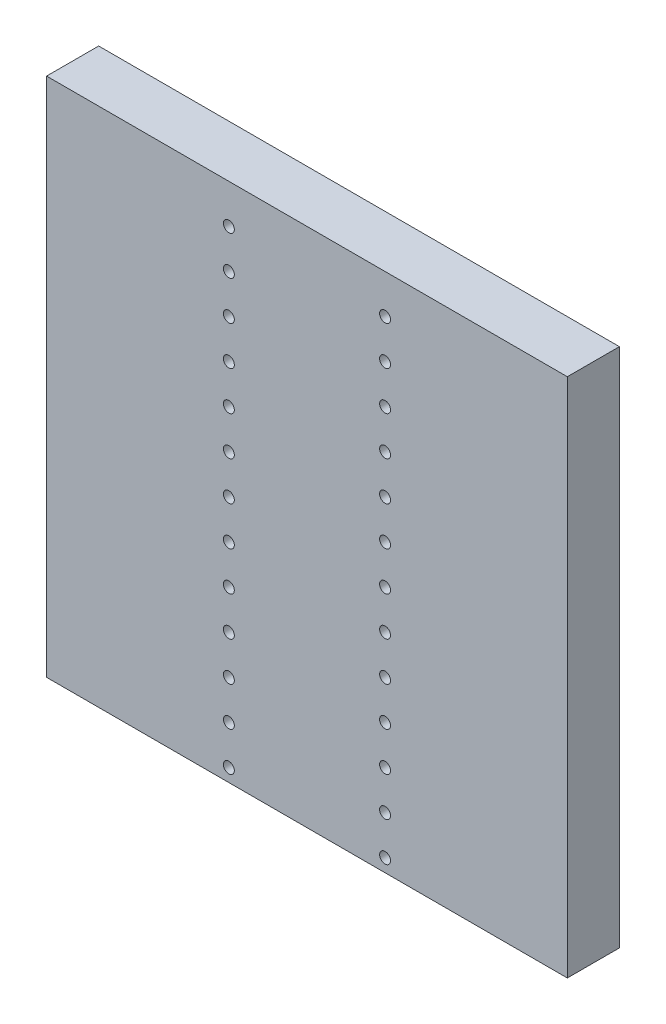
ISO-10303-21;
HEADER;
FILE_DESCRIPTION(('STEP AP214'),'2;1');
FILE_NAME('part.step','',(''),(''),'','','');
FILE_SCHEMA(('AUTOMOTIVE_DESIGN { 1 0 10303 214 1 1 1 1 }'));
ENDSEC;
DATA;
#1=APPLICATION_CONTEXT('core data for automotive mechanical design processes');
#2=APPLICATION_PROTOCOL_DEFINITION('international standard','automotive_design',2000,#1);
#3=PRODUCT_CONTEXT('',#1,'mechanical');
#4=PRODUCT('Part','Part','',(#3));
#5=PRODUCT_RELATED_PRODUCT_CATEGORY('part','',(#4));
#6=PRODUCT_DEFINITION_FORMATION('','',#4);
#7=PRODUCT_DEFINITION_CONTEXT('part definition',#1,'design');
#8=PRODUCT_DEFINITION('design','',#6,#7);
#9=PRODUCT_DEFINITION_SHAPE('','',#8);
#10=(LENGTH_UNIT() NAMED_UNIT(*) SI_UNIT(.MILLI.,.METRE.));
#11=(NAMED_UNIT(*) PLANE_ANGLE_UNIT() SI_UNIT($,.RADIAN.));
#12=(NAMED_UNIT(*) SI_UNIT($,.STERADIAN.) SOLID_ANGLE_UNIT());
#13=UNCERTAINTY_MEASURE_WITH_UNIT(LENGTH_MEASURE(1.E-05),#10,'distance_accuracy_value','');
#14=(GEOMETRIC_REPRESENTATION_CONTEXT(3) GLOBAL_UNCERTAINTY_ASSIGNED_CONTEXT((#13)) GLOBAL_UNIT_ASSIGNED_CONTEXT((#10,
#11,#12)) REPRESENTATION_CONTEXT('',''));
#15=CARTESIAN_POINT('',(0.,0.,0.));
#16=DIRECTION('',(0.,0.,1.));
#17=DIRECTION('',(1.,0.,0.));
#18=AXIS2_PLACEMENT_3D('',#15,#16,#17);
#19=CARTESIAN_POINT('',(100.,100.,20.));
#20=DIRECTION('',(-1.,0.,0.));
#21=DIRECTION('',(0.,-1.,0.));
#22=AXIS2_PLACEMENT_3D('',#19,#20,#21);
#23=PLANE('',#22);
#24=DIRECTION('',(0.,1.,0.));
#25=VECTOR('',#24,1.);
#26=CARTESIAN_POINT('',(100.,100.,0.));
#27=LINE('',#26,#25);
#28=CARTESIAN_POINT('',(100.,-100.,0.));
#29=VERTEX_POINT('',#28);
#30=CARTESIAN_POINT('',(100.,100.,0.));
#31=VERTEX_POINT('',#30);
#32=EDGE_CURVE('E110',#29,#31,#27,.T.);
#33=ORIENTED_EDGE('',*,*,#32,.T.);
#34=DIRECTION('',(0.,0.,-1.));
#35=VECTOR('',#34,1.);
#36=CARTESIAN_POINT('',(100.,100.,20.));
#37=LINE('',#36,#35);
#38=CARTESIAN_POINT('',(100.,100.,20.));
#39=VERTEX_POINT('',#38);
#40=EDGE_CURVE('E11',#39,#31,#37,.T.);
#41=ORIENTED_EDGE('',*,*,#40,.F.);
#42=DIRECTION('',(0.,1.,0.));
#43=VECTOR('',#42,1.);
#44=CARTESIAN_POINT('',(100.,100.,20.));
#45=LINE('',#44,#43);
#46=CARTESIAN_POINT('',(100.,-100.,20.));
#47=VERTEX_POINT('',#46);
#48=EDGE_CURVE('E94',#47,#39,#45,.T.);
#49=ORIENTED_EDGE('',*,*,#48,.F.);
#50=DIRECTION('',(0.,0.,-1.));
#51=VECTOR('',#50,1.);
#52=CARTESIAN_POINT('',(100.,-100.,20.));
#53=LINE('',#52,#51);
#54=EDGE_CURVE('E106',#47,#29,#53,.T.);
#55=ORIENTED_EDGE('',*,*,#54,.T.);
#56=EDGE_LOOP('',(#33,#41,#49,#55));
#57=FACE_BOUND('',#56,.T.);
#58=ADVANCED_FACE('F42',(#57),#23,.F.);
#59=CARTESIAN_POINT('',(-100.,100.,20.));
#60=DIRECTION('',(0.,-1.,0.));
#61=DIRECTION('',(0.,0.,-1.));
#62=AXIS2_PLACEMENT_3D('',#59,#60,#61);
#63=PLANE('',#62);
#64=DIRECTION('',(-1.,0.,0.));
#65=VECTOR('',#64,1.);
#66=CARTESIAN_POINT('',(-100.,100.,0.));
#67=LINE('',#66,#65);
#68=CARTESIAN_POINT('',(-100.,100.,0.));
#69=VERTEX_POINT('',#68);
#70=EDGE_CURVE('E99',#31,#69,#67,.T.);
#71=ORIENTED_EDGE('',*,*,#70,.T.);
#72=DIRECTION('',(0.,0.,-1.));
#73=VECTOR('',#72,1.);
#74=CARTESIAN_POINT('',(-100.,100.,20.));
#75=LINE('',#74,#73);
#76=CARTESIAN_POINT('',(-100.,100.,20.));
#77=VERTEX_POINT('',#76);
#78=EDGE_CURVE('E51',#77,#69,#75,.T.);
#79=ORIENTED_EDGE('',*,*,#78,.F.);
#80=DIRECTION('',(-1.,0.,0.));
#81=VECTOR('',#80,1.);
#82=CARTESIAN_POINT('',(-100.,100.,20.));
#83=LINE('',#82,#81);
#84=EDGE_CURVE('E89',#39,#77,#83,.T.);
#85=ORIENTED_EDGE('',*,*,#84,.F.);
#86=ORIENTED_EDGE('',*,*,#40,.T.);
#87=EDGE_LOOP('',(#71,#79,#85,#86));
#88=FACE_BOUND('',#87,.T.);
#89=ADVANCED_FACE('F98',(#88),#63,.F.);
#90=CARTESIAN_POINT('',(-100.,100.,20.));
#91=DIRECTION('',(1.,0.,0.));
#92=DIRECTION('',(0.,1.,0.));
#93=AXIS2_PLACEMENT_3D('',#90,#91,#92);
#94=PLANE('',#93);
#95=DIRECTION('',(0.,-1.,0.));
#96=VECTOR('',#95,1.);
#97=CARTESIAN_POINT('',(-100.,100.,0.));
#98=LINE('',#97,#96);
#99=CARTESIAN_POINT('',(-100.,-100.,0.));
#100=VERTEX_POINT('',#99);
#101=EDGE_CURVE('E76',#69,#100,#98,.T.);
#102=ORIENTED_EDGE('',*,*,#101,.T.);
#103=DIRECTION('',(0.,0.,-1.));
#104=VECTOR('',#103,1.);
#105=CARTESIAN_POINT('',(-100.,-100.,20.));
#106=LINE('',#105,#104);
#107=CARTESIAN_POINT('',(-100.,-100.,20.));
#108=VERTEX_POINT('',#107);
#109=EDGE_CURVE('E101',#108,#100,#106,.T.);
#110=ORIENTED_EDGE('',*,*,#109,.F.);
#111=DIRECTION('',(0.,-1.,0.));
#112=VECTOR('',#111,1.);
#113=CARTESIAN_POINT('',(-100.,100.,20.));
#114=LINE('',#113,#112);
#115=EDGE_CURVE('E92',#77,#108,#114,.T.);
#116=ORIENTED_EDGE('',*,*,#115,.F.);
#117=ORIENTED_EDGE('',*,*,#78,.T.);
#118=EDGE_LOOP('',(#102,#110,#116,#117));
#119=FACE_BOUND('',#118,.T.);
#120=ADVANCED_FACE('F102',(#119),#94,.F.);
#121=CARTESIAN_POINT('',(-100.,-100.,20.));
#122=DIRECTION('',(0.,1.,0.));
#123=DIRECTION('',(0.,0.,1.));
#124=AXIS2_PLACEMENT_3D('',#121,#122,#123);
#125=PLANE('',#124);
#126=DIRECTION('',(1.,0.,0.));
#127=VECTOR('',#126,1.);
#128=CARTESIAN_POINT('',(-100.,-100.,0.));
#129=LINE('',#128,#127);
#130=EDGE_CURVE('E82',#100,#29,#129,.T.);
#131=ORIENTED_EDGE('',*,*,#130,.T.);
#132=ORIENTED_EDGE('',*,*,#54,.F.);
#133=DIRECTION('',(1.,0.,0.));
#134=VECTOR('',#133,1.);
#135=CARTESIAN_POINT('',(-100.,-100.,20.));
#136=LINE('',#135,#134);
#137=EDGE_CURVE('E59',#108,#47,#136,.T.);
#138=ORIENTED_EDGE('',*,*,#137,.F.);
#139=ORIENTED_EDGE('',*,*,#109,.T.);
#140=EDGE_LOOP('',(#131,#132,#138,#139));
#141=FACE_BOUND('',#140,.T.);
#142=ADVANCED_FACE('F124',(#141),#125,.F.);
#143=CARTESIAN_POINT('',(0.,0.,20.));
#144=DIRECTION('',(0.,0.,1.));
#145=DIRECTION('',(1.,0.,0.));
#146=AXIS2_PLACEMENT_3D('',#143,#144,#145);
#147=PLANE('',#146);
#148=CARTESIAN_POINT('',(-30.,85.,20.));
#149=DIRECTION('',(0.,0.,1.));
#150=DIRECTION('',(1.,0.,0.));
#151=AXIS2_PLACEMENT_3D('',#148,#149,#150);
#152=CIRCLE('',#151,2.1);
#153=CARTESIAN_POINT('',(-27.9,85.,20.));
#154=VERTEX_POINT('',#153);
#155=EDGE_CURVE('E334',#154,#154,#152,.T.);
#156=ORIENTED_EDGE('',*,*,#155,.F.);
#157=EDGE_LOOP('',(#156));
#158=FACE_BOUND('',#157,.T.);
#159=CARTESIAN_POINT('',(-30.,70.,20.));
#160=DIRECTION('',(0.,0.,1.));
#161=DIRECTION('',(1.,0.,0.));
#162=AXIS2_PLACEMENT_3D('',#159,#160,#161);
#163=CIRCLE('',#162,2.1);
#164=CARTESIAN_POINT('',(-27.9,70.,20.));
#165=VERTEX_POINT('',#164);
#166=EDGE_CURVE('E326',#165,#165,#163,.T.);
#167=ORIENTED_EDGE('',*,*,#166,.F.);
#168=EDGE_LOOP('',(#167));
#169=FACE_BOUND('',#168,.T.);
#170=CARTESIAN_POINT('',(-30.,55.,20.));
#171=DIRECTION('',(0.,0.,1.));
#172=DIRECTION('',(1.,0.,0.));
#173=AXIS2_PLACEMENT_3D('',#170,#171,#172);
#174=CIRCLE('',#173,2.1);
#175=CARTESIAN_POINT('',(-27.9,55.,20.));
#176=VERTEX_POINT('',#175);
#177=EDGE_CURVE('E318',#176,#176,#174,.T.);
#178=ORIENTED_EDGE('',*,*,#177,.F.);
#179=EDGE_LOOP('',(#178));
#180=FACE_BOUND('',#179,.T.);
#181=CARTESIAN_POINT('',(-30.,40.,20.));
#182=DIRECTION('',(0.,0.,1.));
#183=DIRECTION('',(1.,0.,0.));
#184=AXIS2_PLACEMENT_3D('',#181,#182,#183);
#185=CIRCLE('',#184,2.1);
#186=CARTESIAN_POINT('',(-27.9,40.,20.));
#187=VERTEX_POINT('',#186);
#188=EDGE_CURVE('E310',#187,#187,#185,.T.);
#189=ORIENTED_EDGE('',*,*,#188,.F.);
#190=EDGE_LOOP('',(#189));
#191=FACE_BOUND('',#190,.T.);
#192=CARTESIAN_POINT('',(-30.,25.,20.));
#193=DIRECTION('',(0.,0.,1.));
#194=DIRECTION('',(1.,0.,0.));
#195=AXIS2_PLACEMENT_3D('',#192,#193,#194);
#196=CIRCLE('',#195,2.1);
#197=CARTESIAN_POINT('',(-27.9,25.,20.));
#198=VERTEX_POINT('',#197);
#199=EDGE_CURVE('E302',#198,#198,#196,.T.);
#200=ORIENTED_EDGE('',*,*,#199,.F.);
#201=EDGE_LOOP('',(#200));
#202=FACE_BOUND('',#201,.T.);
#203=CARTESIAN_POINT('',(-30.,10.,20.));
#204=DIRECTION('',(0.,0.,1.));
#205=DIRECTION('',(1.,0.,0.));
#206=AXIS2_PLACEMENT_3D('',#203,#204,#205);
#207=CIRCLE('',#206,2.1);
#208=CARTESIAN_POINT('',(-27.9,10.,20.));
#209=VERTEX_POINT('',#208);
#210=EDGE_CURVE('E294',#209,#209,#207,.T.);
#211=ORIENTED_EDGE('',*,*,#210,.F.);
#212=EDGE_LOOP('',(#211));
#213=FACE_BOUND('',#212,.T.);
#214=CARTESIAN_POINT('',(-30.,-4.99999999999998,20.));
#215=DIRECTION('',(0.,0.,1.));
#216=DIRECTION('',(1.,0.,0.));
#217=AXIS2_PLACEMENT_3D('',#214,#215,#216);
#218=CIRCLE('',#217,2.1);
#219=CARTESIAN_POINT('',(-27.9,-4.99999999999998,20.));
#220=VERTEX_POINT('',#219);
#221=EDGE_CURVE('E286',#220,#220,#218,.T.);
#222=ORIENTED_EDGE('',*,*,#221,.F.);
#223=EDGE_LOOP('',(#222));
#224=FACE_BOUND('',#223,.T.);
#225=CARTESIAN_POINT('',(-30.,-20.,20.));
#226=DIRECTION('',(0.,0.,1.));
#227=DIRECTION('',(1.,0.,0.));
#228=AXIS2_PLACEMENT_3D('',#225,#226,#227);
#229=CIRCLE('',#228,2.1);
#230=CARTESIAN_POINT('',(-27.9,-20.,20.));
#231=VERTEX_POINT('',#230);
#232=EDGE_CURVE('E278',#231,#231,#229,.T.);
#233=ORIENTED_EDGE('',*,*,#232,.F.);
#234=EDGE_LOOP('',(#233));
#235=FACE_BOUND('',#234,.T.);
#236=CARTESIAN_POINT('',(-30.,-35.,20.));
#237=DIRECTION('',(0.,0.,1.));
#238=DIRECTION('',(1.,0.,0.));
#239=AXIS2_PLACEMENT_3D('',#236,#237,#238);
#240=CIRCLE('',#239,2.1);
#241=CARTESIAN_POINT('',(-27.9,-35.,20.));
#242=VERTEX_POINT('',#241);
#243=EDGE_CURVE('E270',#242,#242,#240,.T.);
#244=ORIENTED_EDGE('',*,*,#243,.F.);
#245=EDGE_LOOP('',(#244));
#246=FACE_BOUND('',#245,.T.);
#247=CARTESIAN_POINT('',(-30.,-50.,20.));
#248=DIRECTION('',(0.,0.,1.));
#249=DIRECTION('',(1.,0.,0.));
#250=AXIS2_PLACEMENT_3D('',#247,#248,#249);
#251=CIRCLE('',#250,2.1);
#252=CARTESIAN_POINT('',(-27.9,-50.,20.));
#253=VERTEX_POINT('',#252);
#254=EDGE_CURVE('E262',#253,#253,#251,.T.);
#255=ORIENTED_EDGE('',*,*,#254,.F.);
#256=EDGE_LOOP('',(#255));
#257=FACE_BOUND('',#256,.T.);
#258=CARTESIAN_POINT('',(-30.,-65.,20.));
#259=DIRECTION('',(0.,0.,1.));
#260=DIRECTION('',(1.,0.,0.));
#261=AXIS2_PLACEMENT_3D('',#258,#259,#260);
#262=CIRCLE('',#261,2.1);
#263=CARTESIAN_POINT('',(-27.9,-65.,20.));
#264=VERTEX_POINT('',#263);
#265=EDGE_CURVE('E254',#264,#264,#262,.T.);
#266=ORIENTED_EDGE('',*,*,#265,.F.);
#267=EDGE_LOOP('',(#266));
#268=FACE_BOUND('',#267,.T.);
#269=CARTESIAN_POINT('',(-30.,-80.,20.));
#270=DIRECTION('',(0.,0.,1.));
#271=DIRECTION('',(1.,0.,0.));
#272=AXIS2_PLACEMENT_3D('',#269,#270,#271);
#273=CIRCLE('',#272,2.1);
#274=CARTESIAN_POINT('',(-27.9,-80.,20.));
#275=VERTEX_POINT('',#274);
#276=EDGE_CURVE('E246',#275,#275,#273,.T.);
#277=ORIENTED_EDGE('',*,*,#276,.F.);
#278=EDGE_LOOP('',(#277));
#279=FACE_BOUND('',#278,.T.);
#280=CARTESIAN_POINT('',(-30.,-95.,20.));
#281=DIRECTION('',(0.,0.,1.));
#282=DIRECTION('',(1.,0.,0.));
#283=AXIS2_PLACEMENT_3D('',#280,#281,#282);
#284=CIRCLE('',#283,2.1);
#285=CARTESIAN_POINT('',(-27.9,-95.,20.));
#286=VERTEX_POINT('',#285);
#287=EDGE_CURVE('E238',#286,#286,#284,.T.);
#288=ORIENTED_EDGE('',*,*,#287,.F.);
#289=EDGE_LOOP('',(#288));
#290=FACE_BOUND('',#289,.T.);
#291=CARTESIAN_POINT('',(30.,85.,20.));
#292=DIRECTION('',(0.,0.,1.));
#293=DIRECTION('',(1.,0.,0.));
#294=AXIS2_PLACEMENT_3D('',#291,#292,#293);
#295=CIRCLE('',#294,2.1);
#296=CARTESIAN_POINT('',(32.1,85.,20.));
#297=VERTEX_POINT('',#296);
#298=EDGE_CURVE('E230',#297,#297,#295,.T.);
#299=ORIENTED_EDGE('',*,*,#298,.F.);
#300=EDGE_LOOP('',(#299));
#301=FACE_BOUND('',#300,.T.);
#302=CARTESIAN_POINT('',(30.,70.,20.));
#303=DIRECTION('',(0.,0.,1.));
#304=DIRECTION('',(1.,0.,0.));
#305=AXIS2_PLACEMENT_3D('',#302,#303,#304);
#306=CIRCLE('',#305,2.1);
#307=CARTESIAN_POINT('',(32.1,70.,20.));
#308=VERTEX_POINT('',#307);
#309=EDGE_CURVE('E222',#308,#308,#306,.T.);
#310=ORIENTED_EDGE('',*,*,#309,.F.);
#311=EDGE_LOOP('',(#310));
#312=FACE_BOUND('',#311,.T.);
#313=CARTESIAN_POINT('',(30.,55.,20.));
#314=DIRECTION('',(0.,0.,1.));
#315=DIRECTION('',(1.,0.,0.));
#316=AXIS2_PLACEMENT_3D('',#313,#314,#315);
#317=CIRCLE('',#316,2.1);
#318=CARTESIAN_POINT('',(32.1,55.,20.));
#319=VERTEX_POINT('',#318);
#320=EDGE_CURVE('E214',#319,#319,#317,.T.);
#321=ORIENTED_EDGE('',*,*,#320,.F.);
#322=EDGE_LOOP('',(#321));
#323=FACE_BOUND('',#322,.T.);
#324=CARTESIAN_POINT('',(30.,40.,20.));
#325=DIRECTION('',(0.,0.,1.));
#326=DIRECTION('',(1.,0.,0.));
#327=AXIS2_PLACEMENT_3D('',#324,#325,#326);
#328=CIRCLE('',#327,2.1);
#329=CARTESIAN_POINT('',(32.1,40.,20.));
#330=VERTEX_POINT('',#329);
#331=EDGE_CURVE('E206',#330,#330,#328,.T.);
#332=ORIENTED_EDGE('',*,*,#331,.F.);
#333=EDGE_LOOP('',(#332));
#334=FACE_BOUND('',#333,.T.);
#335=CARTESIAN_POINT('',(30.,25.,20.));
#336=DIRECTION('',(0.,0.,1.));
#337=DIRECTION('',(1.,0.,0.));
#338=AXIS2_PLACEMENT_3D('',#335,#336,#337);
#339=CIRCLE('',#338,2.1);
#340=CARTESIAN_POINT('',(32.1,25.,20.));
#341=VERTEX_POINT('',#340);
#342=EDGE_CURVE('E198',#341,#341,#339,.T.);
#343=ORIENTED_EDGE('',*,*,#342,.F.);
#344=EDGE_LOOP('',(#343));
#345=FACE_BOUND('',#344,.T.);
#346=CARTESIAN_POINT('',(30.,10.,20.));
#347=DIRECTION('',(0.,0.,1.));
#348=DIRECTION('',(1.,0.,0.));
#349=AXIS2_PLACEMENT_3D('',#346,#347,#348);
#350=CIRCLE('',#349,2.09999999999999);
#351=CARTESIAN_POINT('',(32.1,10.,20.));
#352=VERTEX_POINT('',#351);
#353=EDGE_CURVE('E190',#352,#352,#350,.T.);
#354=ORIENTED_EDGE('',*,*,#353,.F.);
#355=EDGE_LOOP('',(#354));
#356=FACE_BOUND('',#355,.T.);
#357=CARTESIAN_POINT('',(30.,-4.99999999999998,20.));
#358=DIRECTION('',(0.,0.,1.));
#359=DIRECTION('',(1.,0.,0.));
#360=AXIS2_PLACEMENT_3D('',#357,#358,#359);
#361=CIRCLE('',#360,2.09999999999999);
#362=CARTESIAN_POINT('',(32.1,-4.99999999999998,20.));
#363=VERTEX_POINT('',#362);
#364=EDGE_CURVE('E182',#363,#363,#361,.T.);
#365=ORIENTED_EDGE('',*,*,#364,.F.);
#366=EDGE_LOOP('',(#365));
#367=FACE_BOUND('',#366,.T.);
#368=CARTESIAN_POINT('',(30.,-20.,20.));
#369=DIRECTION('',(0.,0.,1.));
#370=DIRECTION('',(1.,0.,0.));
#371=AXIS2_PLACEMENT_3D('',#368,#369,#370);
#372=CIRCLE('',#371,2.1);
#373=CARTESIAN_POINT('',(32.1,-20.,20.));
#374=VERTEX_POINT('',#373);
#375=EDGE_CURVE('E174',#374,#374,#372,.T.);
#376=ORIENTED_EDGE('',*,*,#375,.F.);
#377=EDGE_LOOP('',(#376));
#378=FACE_BOUND('',#377,.T.);
#379=CARTESIAN_POINT('',(30.,-35.,20.));
#380=DIRECTION('',(0.,0.,1.));
#381=DIRECTION('',(1.,0.,0.));
#382=AXIS2_PLACEMENT_3D('',#379,#380,#381);
#383=CIRCLE('',#382,2.1);
#384=CARTESIAN_POINT('',(32.1,-35.,20.));
#385=VERTEX_POINT('',#384);
#386=EDGE_CURVE('E166',#385,#385,#383,.T.);
#387=ORIENTED_EDGE('',*,*,#386,.F.);
#388=EDGE_LOOP('',(#387));
#389=FACE_BOUND('',#388,.T.);
#390=CARTESIAN_POINT('',(30.,-50.,20.));
#391=DIRECTION('',(0.,0.,1.));
#392=DIRECTION('',(1.,0.,0.));
#393=AXIS2_PLACEMENT_3D('',#390,#391,#392);
#394=CIRCLE('',#393,2.1);
#395=CARTESIAN_POINT('',(32.1,-50.,20.));
#396=VERTEX_POINT('',#395);
#397=EDGE_CURVE('E158',#396,#396,#394,.T.);
#398=ORIENTED_EDGE('',*,*,#397,.F.);
#399=EDGE_LOOP('',(#398));
#400=FACE_BOUND('',#399,.T.);
#401=CARTESIAN_POINT('',(30.,-65.,20.));
#402=DIRECTION('',(0.,0.,1.));
#403=DIRECTION('',(1.,0.,0.));
#404=AXIS2_PLACEMENT_3D('',#401,#402,#403);
#405=CIRCLE('',#404,2.1);
#406=CARTESIAN_POINT('',(32.1,-65.,20.));
#407=VERTEX_POINT('',#406);
#408=EDGE_CURVE('E150',#407,#407,#405,.T.);
#409=ORIENTED_EDGE('',*,*,#408,.F.);
#410=EDGE_LOOP('',(#409));
#411=FACE_BOUND('',#410,.T.);
#412=CARTESIAN_POINT('',(30.,-80.,20.));
#413=DIRECTION('',(0.,0.,1.));
#414=DIRECTION('',(1.,0.,0.));
#415=AXIS2_PLACEMENT_3D('',#412,#413,#414);
#416=CIRCLE('',#415,2.1);
#417=CARTESIAN_POINT('',(32.1,-80.,20.));
#418=VERTEX_POINT('',#417);
#419=EDGE_CURVE('E142',#418,#418,#416,.T.);
#420=ORIENTED_EDGE('',*,*,#419,.F.);
#421=EDGE_LOOP('',(#420));
#422=FACE_BOUND('',#421,.T.);
#423=CARTESIAN_POINT('',(30.,-95.,20.));
#424=DIRECTION('',(0.,0.,1.));
#425=DIRECTION('',(1.,0.,0.));
#426=AXIS2_PLACEMENT_3D('',#423,#424,#425);
#427=CIRCLE('',#426,2.09999999999999);
#428=CARTESIAN_POINT('',(32.1,-95.,20.));
#429=VERTEX_POINT('',#428);
#430=EDGE_CURVE('E134',#429,#429,#427,.T.);
#431=ORIENTED_EDGE('',*,*,#430,.F.);
#432=EDGE_LOOP('',(#431));
#433=FACE_BOUND('',#432,.T.);
#434=ORIENTED_EDGE('',*,*,#48,.T.);
#435=ORIENTED_EDGE('',*,*,#84,.T.);
#436=ORIENTED_EDGE('',*,*,#115,.T.);
#437=ORIENTED_EDGE('',*,*,#137,.T.);
#438=EDGE_LOOP('',(#434,#435,#436,#437));
#439=FACE_BOUND('',#438,.T.);
#440=ADVANCED_FACE('F90',(#158,#169,#180,#191,#202,#213,#224,#235,#246,#257,#268,#279,#290,#301,
#312,#323,#334,#345,#356,#367,#378,#389,#400,#411,#422,#433,#439),#147,.T.);
#441=CARTESIAN_POINT('',(0.,0.,0.));
#442=DIRECTION('',(0.,0.,1.));
#443=DIRECTION('',(1.,0.,0.));
#444=AXIS2_PLACEMENT_3D('',#441,#442,#443);
#445=PLANE('',#444);
#446=CARTESIAN_POINT('',(-30.,85.,0.));
#447=DIRECTION('',(0.,0.,1.));
#448=DIRECTION('',(1.,0.,0.));
#449=AXIS2_PLACEMENT_3D('',#446,#447,#448);
#450=CIRCLE('',#449,2.1);
#451=CARTESIAN_POINT('',(-27.9,85.,0.));
#452=VERTEX_POINT('',#451);
#453=EDGE_CURVE('E330',#452,#452,#450,.T.);
#454=ORIENTED_EDGE('',*,*,#453,.T.);
#455=EDGE_LOOP('',(#454));
#456=FACE_BOUND('',#455,.T.);
#457=CARTESIAN_POINT('',(-30.,70.,0.));
#458=DIRECTION('',(0.,0.,1.));
#459=DIRECTION('',(1.,0.,0.));
#460=AXIS2_PLACEMENT_3D('',#457,#458,#459);
#461=CIRCLE('',#460,2.1);
#462=CARTESIAN_POINT('',(-27.9,70.,0.));
#463=VERTEX_POINT('',#462);
#464=EDGE_CURVE('E322',#463,#463,#461,.T.);
#465=ORIENTED_EDGE('',*,*,#464,.T.);
#466=EDGE_LOOP('',(#465));
#467=FACE_BOUND('',#466,.T.);
#468=CARTESIAN_POINT('',(-30.,55.,0.));
#469=DIRECTION('',(0.,0.,1.));
#470=DIRECTION('',(1.,0.,0.));
#471=AXIS2_PLACEMENT_3D('',#468,#469,#470);
#472=CIRCLE('',#471,2.1);
#473=CARTESIAN_POINT('',(-27.9,55.,0.));
#474=VERTEX_POINT('',#473);
#475=EDGE_CURVE('E314',#474,#474,#472,.T.);
#476=ORIENTED_EDGE('',*,*,#475,.T.);
#477=EDGE_LOOP('',(#476));
#478=FACE_BOUND('',#477,.T.);
#479=CARTESIAN_POINT('',(-30.,40.,0.));
#480=DIRECTION('',(0.,0.,1.));
#481=DIRECTION('',(1.,0.,0.));
#482=AXIS2_PLACEMENT_3D('',#479,#480,#481);
#483=CIRCLE('',#482,2.1);
#484=CARTESIAN_POINT('',(-27.9,40.,0.));
#485=VERTEX_POINT('',#484);
#486=EDGE_CURVE('E306',#485,#485,#483,.T.);
#487=ORIENTED_EDGE('',*,*,#486,.T.);
#488=EDGE_LOOP('',(#487));
#489=FACE_BOUND('',#488,.T.);
#490=CARTESIAN_POINT('',(-30.,25.,0.));
#491=DIRECTION('',(0.,0.,1.));
#492=DIRECTION('',(1.,0.,0.));
#493=AXIS2_PLACEMENT_3D('',#490,#491,#492);
#494=CIRCLE('',#493,2.1);
#495=CARTESIAN_POINT('',(-27.9,25.,0.));
#496=VERTEX_POINT('',#495);
#497=EDGE_CURVE('E298',#496,#496,#494,.T.);
#498=ORIENTED_EDGE('',*,*,#497,.T.);
#499=EDGE_LOOP('',(#498));
#500=FACE_BOUND('',#499,.T.);
#501=CARTESIAN_POINT('',(-30.,10.,0.));
#502=DIRECTION('',(0.,0.,1.));
#503=DIRECTION('',(1.,0.,0.));
#504=AXIS2_PLACEMENT_3D('',#501,#502,#503);
#505=CIRCLE('',#504,2.1);
#506=CARTESIAN_POINT('',(-27.9,10.,0.));
#507=VERTEX_POINT('',#506);
#508=EDGE_CURVE('E290',#507,#507,#505,.T.);
#509=ORIENTED_EDGE('',*,*,#508,.T.);
#510=EDGE_LOOP('',(#509));
#511=FACE_BOUND('',#510,.T.);
#512=CARTESIAN_POINT('',(-30.,-4.99999999999998,0.));
#513=DIRECTION('',(0.,0.,1.));
#514=DIRECTION('',(1.,0.,0.));
#515=AXIS2_PLACEMENT_3D('',#512,#513,#514);
#516=CIRCLE('',#515,2.1);
#517=CARTESIAN_POINT('',(-27.9,-4.99999999999998,0.));
#518=VERTEX_POINT('',#517);
#519=EDGE_CURVE('E282',#518,#518,#516,.T.);
#520=ORIENTED_EDGE('',*,*,#519,.T.);
#521=EDGE_LOOP('',(#520));
#522=FACE_BOUND('',#521,.T.);
#523=CARTESIAN_POINT('',(-30.,-20.,0.));
#524=DIRECTION('',(0.,0.,1.));
#525=DIRECTION('',(1.,0.,0.));
#526=AXIS2_PLACEMENT_3D('',#523,#524,#525);
#527=CIRCLE('',#526,2.1);
#528=CARTESIAN_POINT('',(-27.9,-20.,0.));
#529=VERTEX_POINT('',#528);
#530=EDGE_CURVE('E274',#529,#529,#527,.T.);
#531=ORIENTED_EDGE('',*,*,#530,.T.);
#532=EDGE_LOOP('',(#531));
#533=FACE_BOUND('',#532,.T.);
#534=CARTESIAN_POINT('',(-30.,-35.,0.));
#535=DIRECTION('',(0.,0.,1.));
#536=DIRECTION('',(1.,0.,0.));
#537=AXIS2_PLACEMENT_3D('',#534,#535,#536);
#538=CIRCLE('',#537,2.1);
#539=CARTESIAN_POINT('',(-27.9,-35.,0.));
#540=VERTEX_POINT('',#539);
#541=EDGE_CURVE('E266',#540,#540,#538,.T.);
#542=ORIENTED_EDGE('',*,*,#541,.T.);
#543=EDGE_LOOP('',(#542));
#544=FACE_BOUND('',#543,.T.);
#545=CARTESIAN_POINT('',(-30.,-50.,0.));
#546=DIRECTION('',(0.,0.,1.));
#547=DIRECTION('',(1.,0.,0.));
#548=AXIS2_PLACEMENT_3D('',#545,#546,#547);
#549=CIRCLE('',#548,2.1);
#550=CARTESIAN_POINT('',(-27.9,-50.,0.));
#551=VERTEX_POINT('',#550);
#552=EDGE_CURVE('E258',#551,#551,#549,.T.);
#553=ORIENTED_EDGE('',*,*,#552,.T.);
#554=EDGE_LOOP('',(#553));
#555=FACE_BOUND('',#554,.T.);
#556=CARTESIAN_POINT('',(-30.,-65.,0.));
#557=DIRECTION('',(0.,0.,1.));
#558=DIRECTION('',(1.,0.,0.));
#559=AXIS2_PLACEMENT_3D('',#556,#557,#558);
#560=CIRCLE('',#559,2.1);
#561=CARTESIAN_POINT('',(-27.9,-65.,0.));
#562=VERTEX_POINT('',#561);
#563=EDGE_CURVE('E250',#562,#562,#560,.T.);
#564=ORIENTED_EDGE('',*,*,#563,.T.);
#565=EDGE_LOOP('',(#564));
#566=FACE_BOUND('',#565,.T.);
#567=CARTESIAN_POINT('',(-30.,-80.,0.));
#568=DIRECTION('',(0.,0.,1.));
#569=DIRECTION('',(1.,0.,0.));
#570=AXIS2_PLACEMENT_3D('',#567,#568,#569);
#571=CIRCLE('',#570,2.1);
#572=CARTESIAN_POINT('',(-27.9,-80.,0.));
#573=VERTEX_POINT('',#572);
#574=EDGE_CURVE('E242',#573,#573,#571,.T.);
#575=ORIENTED_EDGE('',*,*,#574,.T.);
#576=EDGE_LOOP('',(#575));
#577=FACE_BOUND('',#576,.T.);
#578=CARTESIAN_POINT('',(-30.,-95.,0.));
#579=DIRECTION('',(0.,0.,1.));
#580=DIRECTION('',(1.,0.,0.));
#581=AXIS2_PLACEMENT_3D('',#578,#579,#580);
#582=CIRCLE('',#581,2.1);
#583=CARTESIAN_POINT('',(-27.9,-95.,0.));
#584=VERTEX_POINT('',#583);
#585=EDGE_CURVE('E234',#584,#584,#582,.T.);
#586=ORIENTED_EDGE('',*,*,#585,.T.);
#587=EDGE_LOOP('',(#586));
#588=FACE_BOUND('',#587,.T.);
#589=CARTESIAN_POINT('',(30.,85.,0.));
#590=DIRECTION('',(0.,0.,1.));
#591=DIRECTION('',(1.,0.,0.));
#592=AXIS2_PLACEMENT_3D('',#589,#590,#591);
#593=CIRCLE('',#592,2.1);
#594=CARTESIAN_POINT('',(32.1,85.,0.));
#595=VERTEX_POINT('',#594);
#596=EDGE_CURVE('E226',#595,#595,#593,.T.);
#597=ORIENTED_EDGE('',*,*,#596,.T.);
#598=EDGE_LOOP('',(#597));
#599=FACE_BOUND('',#598,.T.);
#600=CARTESIAN_POINT('',(30.,70.,0.));
#601=DIRECTION('',(0.,0.,1.));
#602=DIRECTION('',(1.,0.,0.));
#603=AXIS2_PLACEMENT_3D('',#600,#601,#602);
#604=CIRCLE('',#603,2.1);
#605=CARTESIAN_POINT('',(32.1,70.,0.));
#606=VERTEX_POINT('',#605);
#607=EDGE_CURVE('E218',#606,#606,#604,.T.);
#608=ORIENTED_EDGE('',*,*,#607,.T.);
#609=EDGE_LOOP('',(#608));
#610=FACE_BOUND('',#609,.T.);
#611=CARTESIAN_POINT('',(30.,55.,0.));
#612=DIRECTION('',(0.,0.,1.));
#613=DIRECTION('',(1.,0.,0.));
#614=AXIS2_PLACEMENT_3D('',#611,#612,#613);
#615=CIRCLE('',#614,2.1);
#616=CARTESIAN_POINT('',(32.1,55.,0.));
#617=VERTEX_POINT('',#616);
#618=EDGE_CURVE('E210',#617,#617,#615,.T.);
#619=ORIENTED_EDGE('',*,*,#618,.T.);
#620=EDGE_LOOP('',(#619));
#621=FACE_BOUND('',#620,.T.);
#622=CARTESIAN_POINT('',(30.,40.,0.));
#623=DIRECTION('',(0.,0.,1.));
#624=DIRECTION('',(1.,0.,0.));
#625=AXIS2_PLACEMENT_3D('',#622,#623,#624);
#626=CIRCLE('',#625,2.1);
#627=CARTESIAN_POINT('',(32.1,40.,0.));
#628=VERTEX_POINT('',#627);
#629=EDGE_CURVE('E202',#628,#628,#626,.T.);
#630=ORIENTED_EDGE('',*,*,#629,.T.);
#631=EDGE_LOOP('',(#630));
#632=FACE_BOUND('',#631,.T.);
#633=CARTESIAN_POINT('',(30.,25.,0.));
#634=DIRECTION('',(0.,0.,1.));
#635=DIRECTION('',(1.,0.,0.));
#636=AXIS2_PLACEMENT_3D('',#633,#634,#635);
#637=CIRCLE('',#636,2.1);
#638=CARTESIAN_POINT('',(32.1,25.,0.));
#639=VERTEX_POINT('',#638);
#640=EDGE_CURVE('E194',#639,#639,#637,.T.);
#641=ORIENTED_EDGE('',*,*,#640,.T.);
#642=EDGE_LOOP('',(#641));
#643=FACE_BOUND('',#642,.T.);
#644=CARTESIAN_POINT('',(30.,10.,0.));
#645=DIRECTION('',(0.,0.,1.));
#646=DIRECTION('',(1.,0.,0.));
#647=AXIS2_PLACEMENT_3D('',#644,#645,#646);
#648=CIRCLE('',#647,2.09999999999999);
#649=CARTESIAN_POINT('',(32.1,10.,0.));
#650=VERTEX_POINT('',#649);
#651=EDGE_CURVE('E186',#650,#650,#648,.T.);
#652=ORIENTED_EDGE('',*,*,#651,.T.);
#653=EDGE_LOOP('',(#652));
#654=FACE_BOUND('',#653,.T.);
#655=CARTESIAN_POINT('',(30.,-4.99999999999998,0.));
#656=DIRECTION('',(0.,0.,1.));
#657=DIRECTION('',(1.,0.,0.));
#658=AXIS2_PLACEMENT_3D('',#655,#656,#657);
#659=CIRCLE('',#658,2.09999999999999);
#660=CARTESIAN_POINT('',(32.1,-4.99999999999998,0.));
#661=VERTEX_POINT('',#660);
#662=EDGE_CURVE('E178',#661,#661,#659,.T.);
#663=ORIENTED_EDGE('',*,*,#662,.T.);
#664=EDGE_LOOP('',(#663));
#665=FACE_BOUND('',#664,.T.);
#666=CARTESIAN_POINT('',(30.,-20.,0.));
#667=DIRECTION('',(0.,0.,1.));
#668=DIRECTION('',(1.,0.,0.));
#669=AXIS2_PLACEMENT_3D('',#666,#667,#668);
#670=CIRCLE('',#669,2.1);
#671=CARTESIAN_POINT('',(32.1,-20.,0.));
#672=VERTEX_POINT('',#671);
#673=EDGE_CURVE('E170',#672,#672,#670,.T.);
#674=ORIENTED_EDGE('',*,*,#673,.T.);
#675=EDGE_LOOP('',(#674));
#676=FACE_BOUND('',#675,.T.);
#677=CARTESIAN_POINT('',(30.,-35.,0.));
#678=DIRECTION('',(0.,0.,1.));
#679=DIRECTION('',(1.,0.,0.));
#680=AXIS2_PLACEMENT_3D('',#677,#678,#679);
#681=CIRCLE('',#680,2.1);
#682=CARTESIAN_POINT('',(32.1,-35.,0.));
#683=VERTEX_POINT('',#682);
#684=EDGE_CURVE('E162',#683,#683,#681,.T.);
#685=ORIENTED_EDGE('',*,*,#684,.T.);
#686=EDGE_LOOP('',(#685));
#687=FACE_BOUND('',#686,.T.);
#688=CARTESIAN_POINT('',(30.,-50.,0.));
#689=DIRECTION('',(0.,0.,1.));
#690=DIRECTION('',(1.,0.,0.));
#691=AXIS2_PLACEMENT_3D('',#688,#689,#690);
#692=CIRCLE('',#691,2.1);
#693=CARTESIAN_POINT('',(32.1,-50.,0.));
#694=VERTEX_POINT('',#693);
#695=EDGE_CURVE('E154',#694,#694,#692,.T.);
#696=ORIENTED_EDGE('',*,*,#695,.T.);
#697=EDGE_LOOP('',(#696));
#698=FACE_BOUND('',#697,.T.);
#699=CARTESIAN_POINT('',(30.,-65.,0.));
#700=DIRECTION('',(0.,0.,1.));
#701=DIRECTION('',(1.,0.,0.));
#702=AXIS2_PLACEMENT_3D('',#699,#700,#701);
#703=CIRCLE('',#702,2.1);
#704=CARTESIAN_POINT('',(32.1,-65.,0.));
#705=VERTEX_POINT('',#704);
#706=EDGE_CURVE('E146',#705,#705,#703,.T.);
#707=ORIENTED_EDGE('',*,*,#706,.T.);
#708=EDGE_LOOP('',(#707));
#709=FACE_BOUND('',#708,.T.);
#710=CARTESIAN_POINT('',(30.,-80.,0.));
#711=DIRECTION('',(0.,0.,1.));
#712=DIRECTION('',(1.,0.,0.));
#713=AXIS2_PLACEMENT_3D('',#710,#711,#712);
#714=CIRCLE('',#713,2.1);
#715=CARTESIAN_POINT('',(32.1,-80.,0.));
#716=VERTEX_POINT('',#715);
#717=EDGE_CURVE('E138',#716,#716,#714,.T.);
#718=ORIENTED_EDGE('',*,*,#717,.T.);
#719=EDGE_LOOP('',(#718));
#720=FACE_BOUND('',#719,.T.);
#721=CARTESIAN_POINT('',(30.,-95.,0.));
#722=DIRECTION('',(0.,0.,1.));
#723=DIRECTION('',(1.,0.,0.));
#724=AXIS2_PLACEMENT_3D('',#721,#722,#723);
#725=CIRCLE('',#724,2.09999999999999);
#726=CARTESIAN_POINT('',(32.1,-95.,0.));
#727=VERTEX_POINT('',#726);
#728=EDGE_CURVE('E114',#727,#727,#725,.T.);
#729=ORIENTED_EDGE('',*,*,#728,.T.);
#730=EDGE_LOOP('',(#729));
#731=FACE_BOUND('',#730,.T.);
#732=ORIENTED_EDGE('',*,*,#32,.F.);
#733=ORIENTED_EDGE('',*,*,#130,.F.);
#734=ORIENTED_EDGE('',*,*,#101,.F.);
#735=ORIENTED_EDGE('',*,*,#70,.F.);
#736=EDGE_LOOP('',(#732,#733,#734,#735));
#737=FACE_BOUND('',#736,.T.);
#738=ADVANCED_FACE('F127',(#456,#467,#478,#489,#500,#511,#522,#533,#544,#555,#566,#577,#588,
#599,#610,#621,#632,#643,#654,#665,#676,#687,#698,#709,#720,#731,#737),#445,.F.);
#739=CARTESIAN_POINT('',(30.,-95.,20.));
#740=DIRECTION('',(0.,0.,1.));
#741=DIRECTION('',(1.,0.,0.));
#742=AXIS2_PLACEMENT_3D('',#739,#740,#741);
#743=CYLINDRICAL_SURFACE('',#742,2.09999999999999);
#744=ORIENTED_EDGE('',*,*,#728,.F.);
#745=EDGE_LOOP('',(#744));
#746=FACE_BOUND('',#745,.T.);
#747=ORIENTED_EDGE('',*,*,#430,.T.);
#748=EDGE_LOOP('',(#747));
#749=FACE_BOUND('',#748,.T.);
#750=ADVANCED_FACE('F394',(#746,#749),#743,.F.);
#751=CARTESIAN_POINT('',(30.,-80.,20.));
#752=DIRECTION('',(0.,0.,1.));
#753=DIRECTION('',(1.,0.,0.));
#754=AXIS2_PLACEMENT_3D('',#751,#752,#753);
#755=CYLINDRICAL_SURFACE('',#754,2.1);
#756=ORIENTED_EDGE('',*,*,#717,.F.);
#757=EDGE_LOOP('',(#756));
#758=FACE_BOUND('',#757,.T.);
#759=ORIENTED_EDGE('',*,*,#419,.T.);
#760=EDGE_LOOP('',(#759));
#761=FACE_BOUND('',#760,.T.);
#762=ADVANCED_FACE('F396',(#758,#761),#755,.F.);
#763=CARTESIAN_POINT('',(30.,-65.,20.));
#764=DIRECTION('',(0.,0.,1.));
#765=DIRECTION('',(1.,0.,0.));
#766=AXIS2_PLACEMENT_3D('',#763,#764,#765);
#767=CYLINDRICAL_SURFACE('',#766,2.1);
#768=ORIENTED_EDGE('',*,*,#706,.F.);
#769=EDGE_LOOP('',(#768));
#770=FACE_BOUND('',#769,.T.);
#771=ORIENTED_EDGE('',*,*,#408,.T.);
#772=EDGE_LOOP('',(#771));
#773=FACE_BOUND('',#772,.T.);
#774=ADVANCED_FACE('F403',(#770,#773),#767,.F.);
#775=CARTESIAN_POINT('',(30.,-50.,20.));
#776=DIRECTION('',(0.,0.,1.));
#777=DIRECTION('',(1.,0.,0.));
#778=AXIS2_PLACEMENT_3D('',#775,#776,#777);
#779=CYLINDRICAL_SURFACE('',#778,2.1);
#780=ORIENTED_EDGE('',*,*,#695,.F.);
#781=EDGE_LOOP('',(#780));
#782=FACE_BOUND('',#781,.T.);
#783=ORIENTED_EDGE('',*,*,#397,.T.);
#784=EDGE_LOOP('',(#783));
#785=FACE_BOUND('',#784,.T.);
#786=ADVANCED_FACE('F637',(#782,#785),#779,.F.);
#787=CARTESIAN_POINT('',(30.,-35.,20.));
#788=DIRECTION('',(0.,0.,1.));
#789=DIRECTION('',(1.,0.,0.));
#790=AXIS2_PLACEMENT_3D('',#787,#788,#789);
#791=CYLINDRICAL_SURFACE('',#790,2.1);
#792=ORIENTED_EDGE('',*,*,#684,.F.);
#793=EDGE_LOOP('',(#792));
#794=FACE_BOUND('',#793,.T.);
#795=ORIENTED_EDGE('',*,*,#386,.T.);
#796=EDGE_LOOP('',(#795));
#797=FACE_BOUND('',#796,.T.);
#798=ADVANCED_FACE('F631',(#794,#797),#791,.F.);
#799=CARTESIAN_POINT('',(30.,-20.,20.));
#800=DIRECTION('',(0.,0.,1.));
#801=DIRECTION('',(1.,0.,0.));
#802=AXIS2_PLACEMENT_3D('',#799,#800,#801);
#803=CYLINDRICAL_SURFACE('',#802,2.1);
#804=ORIENTED_EDGE('',*,*,#673,.F.);
#805=EDGE_LOOP('',(#804));
#806=FACE_BOUND('',#805,.T.);
#807=ORIENTED_EDGE('',*,*,#375,.T.);
#808=EDGE_LOOP('',(#807));
#809=FACE_BOUND('',#808,.T.);
#810=ADVANCED_FACE('F636',(#806,#809),#803,.F.);
#811=CARTESIAN_POINT('',(30.,-4.99999999999998,20.));
#812=DIRECTION('',(0.,0.,1.));
#813=DIRECTION('',(1.,0.,0.));
#814=AXIS2_PLACEMENT_3D('',#811,#812,#813);
#815=CYLINDRICAL_SURFACE('',#814,2.09999999999999);
#816=ORIENTED_EDGE('',*,*,#662,.F.);
#817=EDGE_LOOP('',(#816));
#818=FACE_BOUND('',#817,.T.);
#819=ORIENTED_EDGE('',*,*,#364,.T.);
#820=EDGE_LOOP('',(#819));
#821=FACE_BOUND('',#820,.T.);
#822=ADVANCED_FACE('F677',(#818,#821),#815,.F.);
#823=CARTESIAN_POINT('',(30.,10.,20.));
#824=DIRECTION('',(0.,0.,1.));
#825=DIRECTION('',(1.,0.,0.));
#826=AXIS2_PLACEMENT_3D('',#823,#824,#825);
#827=CYLINDRICAL_SURFACE('',#826,2.09999999999999);
#828=ORIENTED_EDGE('',*,*,#651,.F.);
#829=EDGE_LOOP('',(#828));
#830=FACE_BOUND('',#829,.T.);
#831=ORIENTED_EDGE('',*,*,#353,.T.);
#832=EDGE_LOOP('',(#831));
#833=FACE_BOUND('',#832,.T.);
#834=ADVANCED_FACE('F659',(#830,#833),#827,.F.);
#835=CARTESIAN_POINT('',(30.,25.,20.));
#836=DIRECTION('',(0.,0.,1.));
#837=DIRECTION('',(1.,0.,0.));
#838=AXIS2_PLACEMENT_3D('',#835,#836,#837);
#839=CYLINDRICAL_SURFACE('',#838,2.1);
#840=ORIENTED_EDGE('',*,*,#640,.F.);
#841=EDGE_LOOP('',(#840));
#842=FACE_BOUND('',#841,.T.);
#843=ORIENTED_EDGE('',*,*,#342,.T.);
#844=EDGE_LOOP('',(#843));
#845=FACE_BOUND('',#844,.T.);
#846=ADVANCED_FACE('F653',(#842,#845),#839,.F.);
#847=CARTESIAN_POINT('',(30.,40.,20.));
#848=DIRECTION('',(0.,0.,1.));
#849=DIRECTION('',(1.,0.,0.));
#850=AXIS2_PLACEMENT_3D('',#847,#848,#849);
#851=CYLINDRICAL_SURFACE('',#850,2.1);
#852=ORIENTED_EDGE('',*,*,#629,.F.);
#853=EDGE_LOOP('',(#852));
#854=FACE_BOUND('',#853,.T.);
#855=ORIENTED_EDGE('',*,*,#331,.T.);
#856=EDGE_LOOP('',(#855));
#857=FACE_BOUND('',#856,.T.);
#858=ADVANCED_FACE('F658',(#854,#857),#851,.F.);
#859=CARTESIAN_POINT('',(30.,55.,20.));
#860=DIRECTION('',(0.,0.,1.));
#861=DIRECTION('',(1.,0.,0.));
#862=AXIS2_PLACEMENT_3D('',#859,#860,#861);
#863=CYLINDRICAL_SURFACE('',#862,2.1);
#864=ORIENTED_EDGE('',*,*,#618,.F.);
#865=EDGE_LOOP('',(#864));
#866=FACE_BOUND('',#865,.T.);
#867=ORIENTED_EDGE('',*,*,#320,.T.);
#868=EDGE_LOOP('',(#867));
#869=FACE_BOUND('',#868,.T.);
#870=ADVANCED_FACE('F744',(#866,#869),#863,.F.);
#871=CARTESIAN_POINT('',(30.,70.,20.));
#872=DIRECTION('',(0.,0.,1.));
#873=DIRECTION('',(1.,0.,0.));
#874=AXIS2_PLACEMENT_3D('',#871,#872,#873);
#875=CYLINDRICAL_SURFACE('',#874,2.1);
#876=ORIENTED_EDGE('',*,*,#607,.F.);
#877=EDGE_LOOP('',(#876));
#878=FACE_BOUND('',#877,.T.);
#879=ORIENTED_EDGE('',*,*,#309,.T.);
#880=EDGE_LOOP('',(#879));
#881=FACE_BOUND('',#880,.T.);
#882=ADVANCED_FACE('F757',(#878,#881),#875,.F.);
#883=CARTESIAN_POINT('',(30.,85.,20.));
#884=DIRECTION('',(0.,0.,1.));
#885=DIRECTION('',(1.,0.,0.));
#886=AXIS2_PLACEMENT_3D('',#883,#884,#885);
#887=CYLINDRICAL_SURFACE('',#886,2.1);
#888=ORIENTED_EDGE('',*,*,#596,.F.);
#889=EDGE_LOOP('',(#888));
#890=FACE_BOUND('',#889,.T.);
#891=ORIENTED_EDGE('',*,*,#298,.T.);
#892=EDGE_LOOP('',(#891));
#893=FACE_BOUND('',#892,.T.);
#894=ADVANCED_FACE('F455',(#890,#893),#887,.F.);
#895=CARTESIAN_POINT('',(-30.,-95.,20.));
#896=DIRECTION('',(0.,0.,1.));
#897=DIRECTION('',(1.,0.,0.));
#898=AXIS2_PLACEMENT_3D('',#895,#896,#897);
#899=CYLINDRICAL_SURFACE('',#898,2.1);
#900=ORIENTED_EDGE('',*,*,#585,.F.);
#901=EDGE_LOOP('',(#900));
#902=FACE_BOUND('',#901,.T.);
#903=ORIENTED_EDGE('',*,*,#287,.T.);
#904=EDGE_LOOP('',(#903));
#905=FACE_BOUND('',#904,.T.);
#906=ADVANCED_FACE('F448',(#902,#905),#899,.F.);
#907=CARTESIAN_POINT('',(-30.,-80.,20.));
#908=DIRECTION('',(0.,0.,1.));
#909=DIRECTION('',(1.,0.,0.));
#910=AXIS2_PLACEMENT_3D('',#907,#908,#909);
#911=CYLINDRICAL_SURFACE('',#910,2.1);
#912=ORIENTED_EDGE('',*,*,#574,.F.);
#913=EDGE_LOOP('',(#912));
#914=FACE_BOUND('',#913,.T.);
#915=ORIENTED_EDGE('',*,*,#276,.T.);
#916=EDGE_LOOP('',(#915));
#917=FACE_BOUND('',#916,.T.);
#918=ADVANCED_FACE('F454',(#914,#917),#911,.F.);
#919=CARTESIAN_POINT('',(-30.,-65.,20.));
#920=DIRECTION('',(0.,0.,1.));
#921=DIRECTION('',(1.,0.,0.));
#922=AXIS2_PLACEMENT_3D('',#919,#920,#921);
#923=CYLINDRICAL_SURFACE('',#922,2.1);
#924=ORIENTED_EDGE('',*,*,#563,.F.);
#925=EDGE_LOOP('',(#924));
#926=FACE_BOUND('',#925,.T.);
#927=ORIENTED_EDGE('',*,*,#265,.T.);
#928=EDGE_LOOP('',(#927));
#929=FACE_BOUND('',#928,.T.);
#930=ADVANCED_FACE('F469',(#926,#929),#923,.F.);
#931=CARTESIAN_POINT('',(-30.,-50.,20.));
#932=DIRECTION('',(0.,0.,1.));
#933=DIRECTION('',(1.,0.,0.));
#934=AXIS2_PLACEMENT_3D('',#931,#932,#933);
#935=CYLINDRICAL_SURFACE('',#934,2.1);
#936=ORIENTED_EDGE('',*,*,#552,.F.);
#937=EDGE_LOOP('',(#936));
#938=FACE_BOUND('',#937,.T.);
#939=ORIENTED_EDGE('',*,*,#254,.T.);
#940=EDGE_LOOP('',(#939));
#941=FACE_BOUND('',#940,.T.);
#942=ADVANCED_FACE('F483',(#938,#941),#935,.F.);
#943=CARTESIAN_POINT('',(-30.,-35.,20.));
#944=DIRECTION('',(0.,0.,1.));
#945=DIRECTION('',(1.,0.,0.));
#946=AXIS2_PLACEMENT_3D('',#943,#944,#945);
#947=CYLINDRICAL_SURFACE('',#946,2.1);
#948=ORIENTED_EDGE('',*,*,#541,.F.);
#949=EDGE_LOOP('',(#948));
#950=FACE_BOUND('',#949,.T.);
#951=ORIENTED_EDGE('',*,*,#243,.T.);
#952=EDGE_LOOP('',(#951));
#953=FACE_BOUND('',#952,.T.);
#954=ADVANCED_FACE('F495',(#950,#953),#947,.F.);
#955=CARTESIAN_POINT('',(-30.,-20.,20.));
#956=DIRECTION('',(0.,0.,1.));
#957=DIRECTION('',(1.,0.,0.));
#958=AXIS2_PLACEMENT_3D('',#955,#956,#957);
#959=CYLINDRICAL_SURFACE('',#958,2.1);
#960=ORIENTED_EDGE('',*,*,#530,.F.);
#961=EDGE_LOOP('',(#960));
#962=FACE_BOUND('',#961,.T.);
#963=ORIENTED_EDGE('',*,*,#232,.T.);
#964=EDGE_LOOP('',(#963));
#965=FACE_BOUND('',#964,.T.);
#966=ADVANCED_FACE('F509',(#962,#965),#959,.F.);
#967=CARTESIAN_POINT('',(-30.,-4.99999999999998,20.));
#968=DIRECTION('',(0.,0.,1.));
#969=DIRECTION('',(1.,0.,0.));
#970=AXIS2_PLACEMENT_3D('',#967,#968,#969);
#971=CYLINDRICAL_SURFACE('',#970,2.1);
#972=ORIENTED_EDGE('',*,*,#519,.F.);
#973=EDGE_LOOP('',(#972));
#974=FACE_BOUND('',#973,.T.);
#975=ORIENTED_EDGE('',*,*,#221,.T.);
#976=EDGE_LOOP('',(#975));
#977=FACE_BOUND('',#976,.T.);
#978=ADVANCED_FACE('F521',(#974,#977),#971,.F.);
#979=CARTESIAN_POINT('',(-30.,10.,20.));
#980=DIRECTION('',(0.,0.,1.));
#981=DIRECTION('',(1.,0.,0.));
#982=AXIS2_PLACEMENT_3D('',#979,#980,#981);
#983=CYLINDRICAL_SURFACE('',#982,2.1);
#984=ORIENTED_EDGE('',*,*,#508,.F.);
#985=EDGE_LOOP('',(#984));
#986=FACE_BOUND('',#985,.T.);
#987=ORIENTED_EDGE('',*,*,#210,.T.);
#988=EDGE_LOOP('',(#987));
#989=FACE_BOUND('',#988,.T.);
#990=ADVANCED_FACE('F534',(#986,#989),#983,.F.);
#991=CARTESIAN_POINT('',(-30.,25.,20.));
#992=DIRECTION('',(0.,0.,1.));
#993=DIRECTION('',(1.,0.,0.));
#994=AXIS2_PLACEMENT_3D('',#991,#992,#993);
#995=CYLINDRICAL_SURFACE('',#994,2.1);
#996=ORIENTED_EDGE('',*,*,#497,.F.);
#997=EDGE_LOOP('',(#996));
#998=FACE_BOUND('',#997,.T.);
#999=ORIENTED_EDGE('',*,*,#199,.T.);
#1000=EDGE_LOOP('',(#999));
#1001=FACE_BOUND('',#1000,.T.);
#1002=ADVANCED_FACE('F547',(#998,#1001),#995,.F.);
#1003=CARTESIAN_POINT('',(-30.,40.,20.));
#1004=DIRECTION('',(0.,0.,1.));
#1005=DIRECTION('',(1.,0.,0.));
#1006=AXIS2_PLACEMENT_3D('',#1003,#1004,#1005);
#1007=CYLINDRICAL_SURFACE('',#1006,2.1);
#1008=ORIENTED_EDGE('',*,*,#486,.F.);
#1009=EDGE_LOOP('',(#1008));
#1010=FACE_BOUND('',#1009,.T.);
#1011=ORIENTED_EDGE('',*,*,#188,.T.);
#1012=EDGE_LOOP('',(#1011));
#1013=FACE_BOUND('',#1012,.T.);
#1014=ADVANCED_FACE('F561',(#1010,#1013),#1007,.F.);
#1015=CARTESIAN_POINT('',(-30.,55.,20.));
#1016=DIRECTION('',(0.,0.,1.));
#1017=DIRECTION('',(1.,0.,0.));
#1018=AXIS2_PLACEMENT_3D('',#1015,#1016,#1017);
#1019=CYLINDRICAL_SURFACE('',#1018,2.1);
#1020=ORIENTED_EDGE('',*,*,#475,.F.);
#1021=EDGE_LOOP('',(#1020));
#1022=FACE_BOUND('',#1021,.T.);
#1023=ORIENTED_EDGE('',*,*,#177,.T.);
#1024=EDGE_LOOP('',(#1023));
#1025=FACE_BOUND('',#1024,.T.);
#1026=ADVANCED_FACE('F574',(#1022,#1025),#1019,.F.);
#1027=CARTESIAN_POINT('',(-30.,70.,20.));
#1028=DIRECTION('',(0.,0.,1.));
#1029=DIRECTION('',(1.,0.,0.));
#1030=AXIS2_PLACEMENT_3D('',#1027,#1028,#1029);
#1031=CYLINDRICAL_SURFACE('',#1030,2.1);
#1032=ORIENTED_EDGE('',*,*,#464,.F.);
#1033=EDGE_LOOP('',(#1032));
#1034=FACE_BOUND('',#1033,.T.);
#1035=ORIENTED_EDGE('',*,*,#166,.T.);
#1036=EDGE_LOOP('',(#1035));
#1037=FACE_BOUND('',#1036,.T.);
#1038=ADVANCED_FACE('F586',(#1034,#1037),#1031,.F.);
#1039=CARTESIAN_POINT('',(-30.,85.,20.));
#1040=DIRECTION('',(0.,0.,1.));
#1041=DIRECTION('',(1.,0.,0.));
#1042=AXIS2_PLACEMENT_3D('',#1039,#1040,#1041);
#1043=CYLINDRICAL_SURFACE('',#1042,2.1);
#1044=ORIENTED_EDGE('',*,*,#453,.F.);
#1045=EDGE_LOOP('',(#1044));
#1046=FACE_BOUND('',#1045,.T.);
#1047=ORIENTED_EDGE('',*,*,#155,.T.);
#1048=EDGE_LOOP('',(#1047));
#1049=FACE_BOUND('',#1048,.T.);
#1050=ADVANCED_FACE('F339',(#1046,#1049),#1043,.F.);
#1051=CLOSED_SHELL('',(#58,#89,#120,#142,#440,#738,#750,#762,#774,#786,#798,#810,#822,#834,#846,
#858,#870,#882,#894,#906,#918,#930,#942,#954,#966,#978,#990,#1002,#1014,#1026,#1038,#1050));
#1052=MANIFOLD_SOLID_BREP('B2',#1051);
#1053=ADVANCED_BREP_SHAPE_REPRESENTATION('',(#18,#1052),#14);
#1054=SHAPE_DEFINITION_REPRESENTATION(#9,#1053);
ENDSEC;
END-ISO-10303-21;
